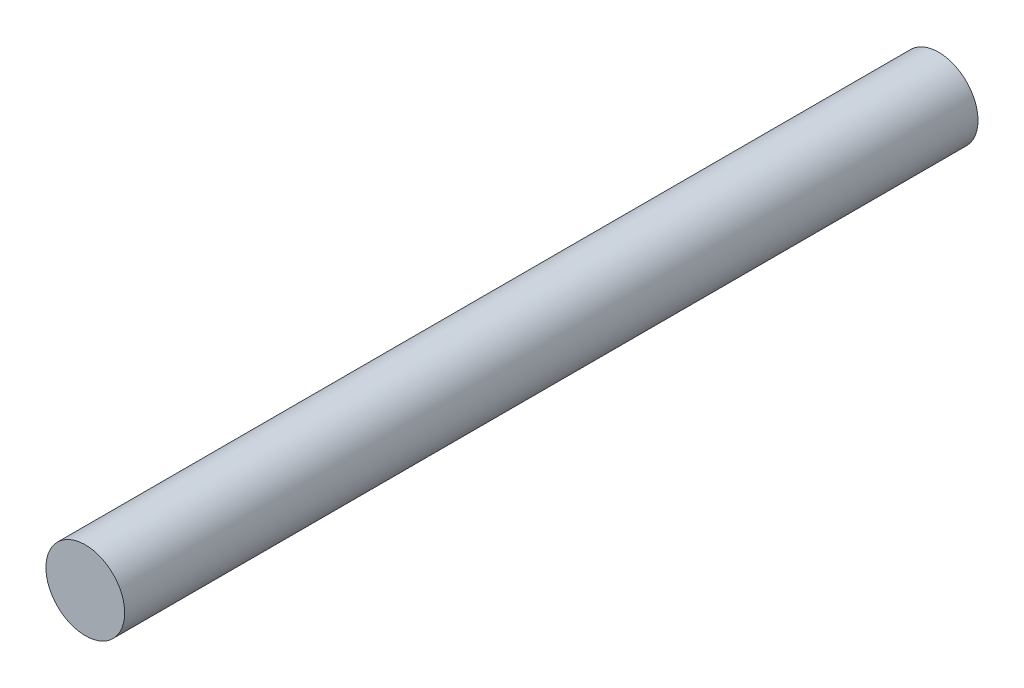
ISO-10303-21;
HEADER;
FILE_DESCRIPTION(('STEP AP214'),'2;1');
FILE_NAME('part.step','',(''),(''),'','','');
FILE_SCHEMA(('AUTOMOTIVE_DESIGN { 1 0 10303 214 1 1 1 1 }'));
ENDSEC;
DATA;
#1=APPLICATION_CONTEXT('core data for automotive mechanical design processes');
#2=APPLICATION_PROTOCOL_DEFINITION('international standard','automotive_design',2000,#1);
#3=PRODUCT_CONTEXT('',#1,'mechanical');
#4=PRODUCT('Part','Part','',(#3));
#5=PRODUCT_RELATED_PRODUCT_CATEGORY('part','',(#4));
#6=PRODUCT_DEFINITION_FORMATION('','',#4);
#7=PRODUCT_DEFINITION_CONTEXT('part definition',#1,'design');
#8=PRODUCT_DEFINITION('design','',#6,#7);
#9=PRODUCT_DEFINITION_SHAPE('','',#8);
#10=(LENGTH_UNIT() NAMED_UNIT(*) SI_UNIT(.MILLI.,.METRE.));
#11=(NAMED_UNIT(*) PLANE_ANGLE_UNIT() SI_UNIT($,.RADIAN.));
#12=(NAMED_UNIT(*) SI_UNIT($,.STERADIAN.) SOLID_ANGLE_UNIT());
#13=UNCERTAINTY_MEASURE_WITH_UNIT(LENGTH_MEASURE(1.E-05),#10,'distance_accuracy_value','');
#14=(GEOMETRIC_REPRESENTATION_CONTEXT(3) GLOBAL_UNCERTAINTY_ASSIGNED_CONTEXT((#13)) GLOBAL_UNIT_ASSIGNED_CONTEXT((#10,
#11,#12)) REPRESENTATION_CONTEXT('',''));
#15=CARTESIAN_POINT('',(0.,0.,0.));
#16=DIRECTION('',(0.,0.,1.));
#17=DIRECTION('',(1.,0.,0.));
#18=AXIS2_PLACEMENT_3D('',#15,#16,#17);
#19=CARTESIAN_POINT('',(0.,0.,32.5));
#20=DIRECTION('',(0.,0.,-1.));
#21=DIRECTION('',(-1.,0.,0.));
#22=AXIS2_PLACEMENT_3D('',#19,#20,#21);
#23=CYLINDRICAL_SURFACE('',#22,3.);
#24=CARTESIAN_POINT('',(0.,0.,32.5));
#25=DIRECTION('',(0.,0.,1.));
#26=DIRECTION('',(1.,0.,0.));
#27=AXIS2_PLACEMENT_3D('',#24,#25,#26);
#28=CIRCLE('',#27,3.);
#29=CARTESIAN_POINT('',(3.,0.,32.5));
#30=VERTEX_POINT('',#29);
#31=EDGE_CURVE('E10',#30,#30,#28,.T.);
#32=ORIENTED_EDGE('',*,*,#31,.F.);
#33=EDGE_LOOP('',(#32));
#34=FACE_BOUND('',#33,.T.);
#35=CARTESIAN_POINT('',(0.,0.,-32.5));
#36=DIRECTION('',(0.,0.,1.));
#37=DIRECTION('',(1.,0.,0.));
#38=AXIS2_PLACEMENT_3D('',#35,#36,#37);
#39=CIRCLE('',#38,3.);
#40=CARTESIAN_POINT('',(3.,0.,-32.5));
#41=VERTEX_POINT('',#40);
#42=EDGE_CURVE('E34',#41,#41,#39,.T.);
#43=ORIENTED_EDGE('',*,*,#42,.T.);
#44=EDGE_LOOP('',(#43));
#45=FACE_BOUND('',#44,.T.);
#46=ADVANCED_FACE('F31',(#34,#45),#23,.T.);
#47=CARTESIAN_POINT('',(0.,0.,32.5));
#48=DIRECTION('',(0.,0.,1.));
#49=DIRECTION('',(1.,0.,0.));
#50=AXIS2_PLACEMENT_3D('',#47,#48,#49);
#51=PLANE('',#50);
#52=ORIENTED_EDGE('',*,*,#31,.T.);
#53=EDGE_LOOP('',(#52));
#54=FACE_BOUND('',#53,.T.);
#55=ADVANCED_FACE('F46',(#54),#51,.T.);
#56=CARTESIAN_POINT('',(0.,0.,-32.5));
#57=DIRECTION('',(0.,0.,1.));
#58=DIRECTION('',(1.,0.,0.));
#59=AXIS2_PLACEMENT_3D('',#56,#57,#58);
#60=PLANE('',#59);
#61=ORIENTED_EDGE('',*,*,#42,.F.);
#62=EDGE_LOOP('',(#61));
#63=FACE_BOUND('',#62,.T.);
#64=ADVANCED_FACE('F44',(#63),#60,.F.);
#65=CLOSED_SHELL('',(#46,#55,#64));
#66=MANIFOLD_SOLID_BREP('B2',#65);
#67=ADVANCED_BREP_SHAPE_REPRESENTATION('',(#18,#66),#14);
#68=SHAPE_DEFINITION_REPRESENTATION(#9,#67);
ENDSEC;
END-ISO-10303-21;
